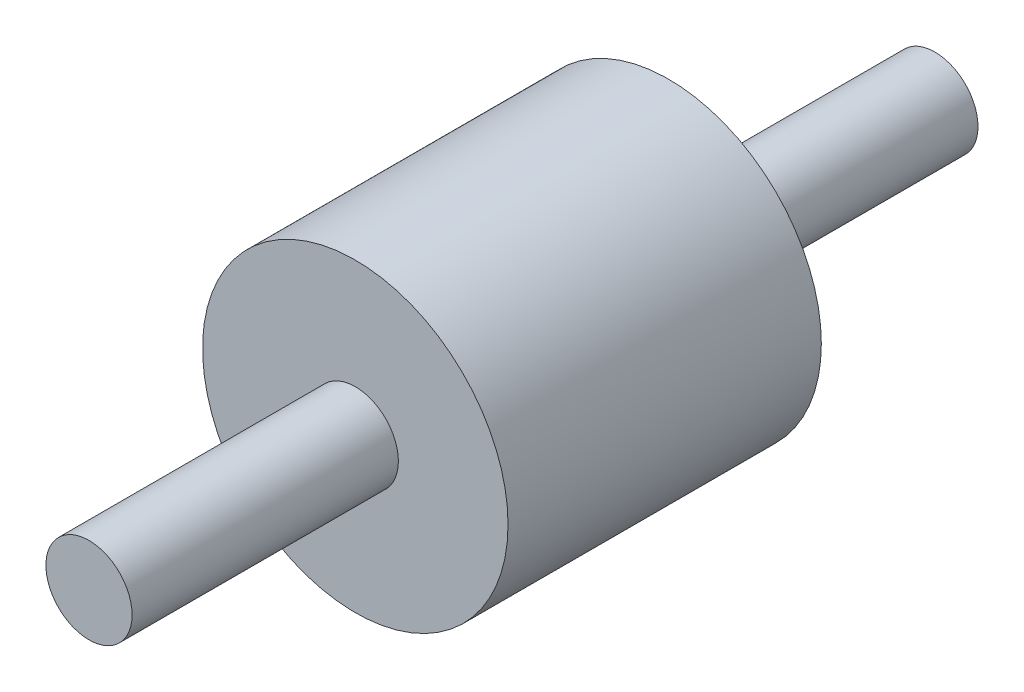
ISO-10303-21;
HEADER;
FILE_DESCRIPTION(('STEP AP214'),'2;1');
FILE_NAME('part.step','',(''),(''),'','','');
FILE_SCHEMA(('AUTOMOTIVE_DESIGN { 1 0 10303 214 1 1 1 1 }'));
ENDSEC;
DATA;
#1=APPLICATION_CONTEXT('core data for automotive mechanical design processes');
#2=APPLICATION_PROTOCOL_DEFINITION('international standard','automotive_design',2000,#1);
#3=PRODUCT_CONTEXT('',#1,'mechanical');
#4=PRODUCT('Part','Part','',(#3));
#5=PRODUCT_RELATED_PRODUCT_CATEGORY('part','',(#4));
#6=PRODUCT_DEFINITION_FORMATION('','',#4);
#7=PRODUCT_DEFINITION_CONTEXT('part definition',#1,'design');
#8=PRODUCT_DEFINITION('design','',#6,#7);
#9=PRODUCT_DEFINITION_SHAPE('','',#8);
#10=(LENGTH_UNIT() NAMED_UNIT(*) SI_UNIT(.MILLI.,.METRE.));
#11=(NAMED_UNIT(*) PLANE_ANGLE_UNIT() SI_UNIT($,.RADIAN.));
#12=(NAMED_UNIT(*) SI_UNIT($,.STERADIAN.) SOLID_ANGLE_UNIT());
#13=UNCERTAINTY_MEASURE_WITH_UNIT(LENGTH_MEASURE(1.E-05),#10,'distance_accuracy_value','');
#14=(GEOMETRIC_REPRESENTATION_CONTEXT(3) GLOBAL_UNCERTAINTY_ASSIGNED_CONTEXT((#13)) GLOBAL_UNIT_ASSIGNED_CONTEXT((#10,
#11,#12)) REPRESENTATION_CONTEXT('',''));
#15=CARTESIAN_POINT('',(0.,0.,0.));
#16=DIRECTION('',(0.,0.,1.));
#17=DIRECTION('',(1.,0.,0.));
#18=AXIS2_PLACEMENT_3D('',#15,#16,#17);
#19=CARTESIAN_POINT('',(0.,0.,20.));
#20=DIRECTION('',(0.,0.,-1.));
#21=DIRECTION('',(-1.,0.,0.));
#22=AXIS2_PLACEMENT_3D('',#19,#20,#21);
#23=CYLINDRICAL_SURFACE('',#22,9.75);
#24=CARTESIAN_POINT('',(0.,0.,20.));
#25=DIRECTION('',(0.,0.,1.));
#26=DIRECTION('',(1.,0.,0.));
#27=AXIS2_PLACEMENT_3D('',#24,#25,#26);
#28=CIRCLE('',#27,9.75);
#29=CARTESIAN_POINT('',(9.75,0.,20.));
#30=VERTEX_POINT('',#29);
#31=EDGE_CURVE('E41',#30,#30,#28,.T.);
#32=ORIENTED_EDGE('',*,*,#31,.F.);
#33=EDGE_LOOP('',(#32));
#34=FACE_BOUND('',#33,.T.);
#35=CARTESIAN_POINT('',(0.,0.,0.));
#36=DIRECTION('',(0.,0.,1.));
#37=DIRECTION('',(1.,0.,0.));
#38=AXIS2_PLACEMENT_3D('',#35,#36,#37);
#39=CIRCLE('',#38,9.75);
#40=CARTESIAN_POINT('',(9.75,0.,0.));
#41=VERTEX_POINT('',#40);
#42=EDGE_CURVE('E46',#41,#41,#39,.T.);
#43=ORIENTED_EDGE('',*,*,#42,.T.);
#44=EDGE_LOOP('',(#43));
#45=FACE_BOUND('',#44,.T.);
#46=ADVANCED_FACE('F34',(#34,#45),#23,.T.);
#47=CARTESIAN_POINT('',(0.,0.,20.));
#48=DIRECTION('',(0.,0.,1.));
#49=DIRECTION('',(1.,0.,0.));
#50=AXIS2_PLACEMENT_3D('',#47,#48,#49);
#51=PLANE('',#50);
#52=CARTESIAN_POINT('',(0.,0.,20.));
#53=DIRECTION('',(0.,0.,1.));
#54=DIRECTION('',(1.,0.,0.));
#55=AXIS2_PLACEMENT_3D('',#52,#53,#54);
#56=CIRCLE('',#55,2.75);
#57=CARTESIAN_POINT('',(2.75,0.,20.));
#58=VERTEX_POINT('',#57);
#59=EDGE_CURVE('E10',#58,#58,#56,.T.);
#60=ORIENTED_EDGE('',*,*,#59,.F.);
#61=EDGE_LOOP('',(#60));
#62=FACE_BOUND('',#61,.T.);
#63=ORIENTED_EDGE('',*,*,#31,.T.);
#64=EDGE_LOOP('',(#63));
#65=FACE_BOUND('',#64,.T.);
#66=ADVANCED_FACE('F79',(#62,#65),#51,.T.);
#67=CARTESIAN_POINT('',(0.,0.,0.));
#68=DIRECTION('',(0.,0.,1.));
#69=DIRECTION('',(1.,0.,0.));
#70=AXIS2_PLACEMENT_3D('',#67,#68,#69);
#71=PLANE('',#70);
#72=CARTESIAN_POINT('',(0.,0.,0.));
#73=DIRECTION('',(0.,0.,1.));
#74=DIRECTION('',(1.,0.,0.));
#75=AXIS2_PLACEMENT_3D('',#72,#73,#74);
#76=CIRCLE('',#75,2.75);
#77=CARTESIAN_POINT('',(2.75,0.,0.));
#78=VERTEX_POINT('',#77);
#79=EDGE_CURVE('E37',#78,#78,#76,.T.);
#80=ORIENTED_EDGE('',*,*,#79,.T.);
#81=EDGE_LOOP('',(#80));
#82=FACE_BOUND('',#81,.T.);
#83=ORIENTED_EDGE('',*,*,#42,.F.);
#84=EDGE_LOOP('',(#83));
#85=FACE_BOUND('',#84,.T.);
#86=ADVANCED_FACE('F84',(#82,#85),#71,.F.);
#87=CARTESIAN_POINT('',(0.,0.,-17.));
#88=DIRECTION('',(0.,0.,1.));
#89=DIRECTION('',(1.,0.,0.));
#90=AXIS2_PLACEMENT_3D('',#87,#88,#89);
#91=PLANE('',#90);
#92=CARTESIAN_POINT('',(0.,0.,-17.));
#93=DIRECTION('',(0.,0.,1.));
#94=DIRECTION('',(1.,0.,0.));
#95=AXIS2_PLACEMENT_3D('',#92,#93,#94);
#96=CIRCLE('',#95,2.75);
#97=CARTESIAN_POINT('',(2.75,0.,-17.));
#98=VERTEX_POINT('',#97);
#99=EDGE_CURVE('E49',#98,#98,#96,.T.);
#100=ORIENTED_EDGE('',*,*,#99,.F.);
#101=EDGE_LOOP('',(#100));
#102=FACE_BOUND('',#101,.T.);
#103=ADVANCED_FACE('F75',(#102),#91,.F.);
#104=CARTESIAN_POINT('',(0.,0.,-17.));
#105=DIRECTION('',(0.,0.,1.));
#106=DIRECTION('',(1.,0.,0.));
#107=AXIS2_PLACEMENT_3D('',#104,#105,#106);
#108=CYLINDRICAL_SURFACE('',#107,2.75);
#109=ORIENTED_EDGE('',*,*,#99,.T.);
#110=EDGE_LOOP('',(#109));
#111=FACE_BOUND('',#110,.T.);
#112=ORIENTED_EDGE('',*,*,#79,.F.);
#113=EDGE_LOOP('',(#112));
#114=FACE_BOUND('',#113,.T.);
#115=ADVANCED_FACE('F68',(#111,#114),#108,.T.);
#116=ORIENTED_EDGE('',*,*,#59,.T.);
#117=EDGE_LOOP('',(#116));
#118=FACE_BOUND('',#117,.T.);
#119=CARTESIAN_POINT('',(0.,0.,37.));
#120=DIRECTION('',(0.,0.,1.));
#121=DIRECTION('',(1.,0.,0.));
#122=AXIS2_PLACEMENT_3D('',#119,#120,#121);
#123=CIRCLE('',#122,2.75);
#124=CARTESIAN_POINT('',(2.75,0.,37.));
#125=VERTEX_POINT('',#124);
#126=EDGE_CURVE('E58',#125,#125,#123,.T.);
#127=ORIENTED_EDGE('',*,*,#126,.F.);
#128=EDGE_LOOP('',(#127));
#129=FACE_BOUND('',#128,.T.);
#130=ADVANCED_FACE('F66',(#118,#129),#108,.T.);
#131=CARTESIAN_POINT('',(0.,0.,37.));
#132=DIRECTION('',(0.,0.,1.));
#133=DIRECTION('',(1.,0.,0.));
#134=AXIS2_PLACEMENT_3D('',#131,#132,#133);
#135=PLANE('',#134);
#136=ORIENTED_EDGE('',*,*,#126,.T.);
#137=EDGE_LOOP('',(#136));
#138=FACE_BOUND('',#137,.T.);
#139=ADVANCED_FACE('F64',(#138),#135,.T.);
#140=CLOSED_SHELL('',(#46,#66,#86,#103,#115,#130,#139));
#141=MANIFOLD_SOLID_BREP('B2',#140);
#142=ADVANCED_BREP_SHAPE_REPRESENTATION('',(#18,#141),#14);
#143=SHAPE_DEFINITION_REPRESENTATION(#9,#142);
ENDSEC;
END-ISO-10303-21;
